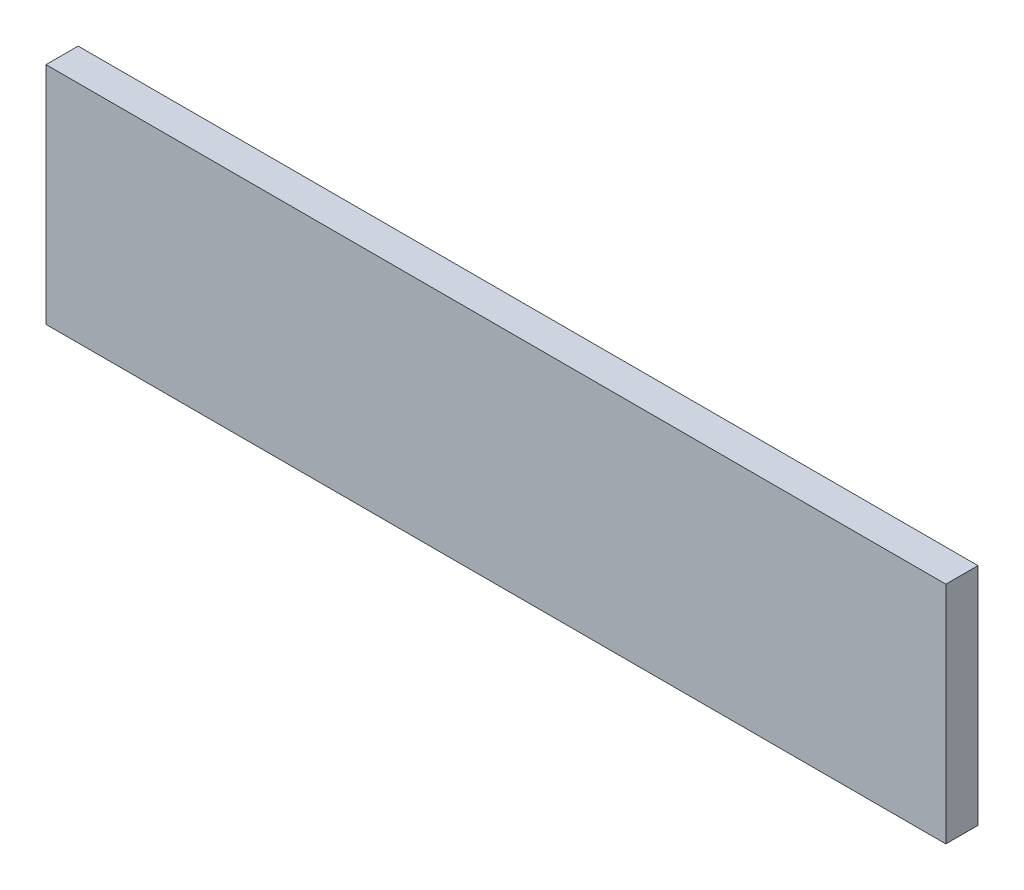
ISO-10303-21;
HEADER;
FILE_DESCRIPTION(('STEP AP214'),'2;1');
FILE_NAME('part.step','',(''),(''),'','','');
FILE_SCHEMA(('AUTOMOTIVE_DESIGN { 1 0 10303 214 1 1 1 1 }'));
ENDSEC;
DATA;
#1=APPLICATION_CONTEXT('core data for automotive mechanical design processes');
#2=APPLICATION_PROTOCOL_DEFINITION('international standard','automotive_design',2000,#1);
#3=PRODUCT_CONTEXT('',#1,'mechanical');
#4=PRODUCT('Part','Part','',(#3));
#5=PRODUCT_RELATED_PRODUCT_CATEGORY('part','',(#4));
#6=PRODUCT_DEFINITION_FORMATION('','',#4);
#7=PRODUCT_DEFINITION_CONTEXT('part definition',#1,'design');
#8=PRODUCT_DEFINITION('design','',#6,#7);
#9=PRODUCT_DEFINITION_SHAPE('','',#8);
#10=(LENGTH_UNIT() NAMED_UNIT(*) SI_UNIT(.MILLI.,.METRE.));
#11=(NAMED_UNIT(*) PLANE_ANGLE_UNIT() SI_UNIT($,.RADIAN.));
#12=(NAMED_UNIT(*) SI_UNIT($,.STERADIAN.) SOLID_ANGLE_UNIT());
#13=UNCERTAINTY_MEASURE_WITH_UNIT(LENGTH_MEASURE(1.E-05),#10,'distance_accuracy_value','');
#14=(GEOMETRIC_REPRESENTATION_CONTEXT(3) GLOBAL_UNCERTAINTY_ASSIGNED_CONTEXT((#13)) GLOBAL_UNIT_ASSIGNED_CONTEXT((#10,
#11,#12)) REPRESENTATION_CONTEXT('',''));
#15=CARTESIAN_POINT('',(0.,0.,0.));
#16=DIRECTION('',(0.,0.,1.));
#17=DIRECTION('',(1.,0.,0.));
#18=AXIS2_PLACEMENT_3D('',#15,#16,#17);
#19=CARTESIAN_POINT('',(-140.,-35.,10.));
#20=DIRECTION('',(1.,0.,0.));
#21=DIRECTION('',(0.,0.,-1.));
#22=AXIS2_PLACEMENT_3D('',#19,#20,#21);
#23=PLANE('',#22);
#24=DIRECTION('',(0.,-1.,0.));
#25=VECTOR('',#24,1.);
#26=CARTESIAN_POINT('',(-140.,-35.,0.));
#27=LINE('',#26,#25);
#28=CARTESIAN_POINT('',(-140.,35.,0.));
#29=VERTEX_POINT('',#28);
#30=CARTESIAN_POINT('',(-140.,-35.,0.));
#31=VERTEX_POINT('',#30);
#32=EDGE_CURVE('E95',#29,#31,#27,.T.);
#33=ORIENTED_EDGE('',*,*,#32,.T.);
#34=DIRECTION('',(0.,0.,-1.));
#35=VECTOR('',#34,1.);
#36=CARTESIAN_POINT('',(-140.,-35.,10.));
#37=LINE('',#36,#35);
#38=CARTESIAN_POINT('',(-140.,-35.,10.));
#39=VERTEX_POINT('',#38);
#40=EDGE_CURVE('E11',#39,#31,#37,.T.);
#41=ORIENTED_EDGE('',*,*,#40,.F.);
#42=DIRECTION('',(0.,-1.,0.));
#43=VECTOR('',#42,1.);
#44=CARTESIAN_POINT('',(-140.,-35.,10.));
#45=LINE('',#44,#43);
#46=CARTESIAN_POINT('',(-140.,35.,10.));
#47=VERTEX_POINT('',#46);
#48=EDGE_CURVE('E83',#47,#39,#45,.T.);
#49=ORIENTED_EDGE('',*,*,#48,.F.);
#50=DIRECTION('',(0.,0.,-1.));
#51=VECTOR('',#50,1.);
#52=CARTESIAN_POINT('',(-140.,35.,10.));
#53=LINE('',#52,#51);
#54=EDGE_CURVE('E91',#47,#29,#53,.T.);
#55=ORIENTED_EDGE('',*,*,#54,.T.);
#56=EDGE_LOOP('',(#33,#41,#49,#55));
#57=FACE_BOUND('',#56,.T.);
#58=ADVANCED_FACE('F32',(#57),#23,.F.);
#59=CARTESIAN_POINT('',(-140.,-35.,10.));
#60=DIRECTION('',(0.,1.,0.));
#61=DIRECTION('',(0.,0.,1.));
#62=AXIS2_PLACEMENT_3D('',#59,#60,#61);
#63=PLANE('',#62);
#64=DIRECTION('',(1.,0.,0.));
#65=VECTOR('',#64,1.);
#66=CARTESIAN_POINT('',(-140.,-35.,0.));
#67=LINE('',#66,#65);
#68=CARTESIAN_POINT('',(140.,-35.,0.));
#69=VERTEX_POINT('',#68);
#70=EDGE_CURVE('E87',#31,#69,#67,.T.);
#71=ORIENTED_EDGE('',*,*,#70,.T.);
#72=DIRECTION('',(0.,0.,-1.));
#73=VECTOR('',#72,1.);
#74=CARTESIAN_POINT('',(140.,-35.,10.));
#75=LINE('',#74,#73);
#76=CARTESIAN_POINT('',(140.,-35.,10.));
#77=VERTEX_POINT('',#76);
#78=EDGE_CURVE('E40',#77,#69,#75,.T.);
#79=ORIENTED_EDGE('',*,*,#78,.F.);
#80=DIRECTION('',(1.,0.,0.));
#81=VECTOR('',#80,1.);
#82=CARTESIAN_POINT('',(-140.,-35.,10.));
#83=LINE('',#82,#81);
#84=EDGE_CURVE('E78',#39,#77,#83,.T.);
#85=ORIENTED_EDGE('',*,*,#84,.F.);
#86=ORIENTED_EDGE('',*,*,#40,.T.);
#87=EDGE_LOOP('',(#71,#79,#85,#86));
#88=FACE_BOUND('',#87,.T.);
#89=ADVANCED_FACE('F86',(#88),#63,.F.);
#90=CARTESIAN_POINT('',(140.,-35.,10.));
#91=DIRECTION('',(-1.,0.,0.));
#92=DIRECTION('',(0.,0.,1.));
#93=AXIS2_PLACEMENT_3D('',#90,#91,#92);
#94=PLANE('',#93);
#95=DIRECTION('',(0.,1.,0.));
#96=VECTOR('',#95,1.);
#97=CARTESIAN_POINT('',(140.,-35.,0.));
#98=LINE('',#97,#96);
#99=CARTESIAN_POINT('',(140.,35.,0.));
#100=VERTEX_POINT('',#99);
#101=EDGE_CURVE('E65',#69,#100,#98,.T.);
#102=ORIENTED_EDGE('',*,*,#101,.T.);
#103=DIRECTION('',(0.,0.,-1.));
#104=VECTOR('',#103,1.);
#105=CARTESIAN_POINT('',(140.,35.,10.));
#106=LINE('',#105,#104);
#107=CARTESIAN_POINT('',(140.,35.,10.));
#108=VERTEX_POINT('',#107);
#109=EDGE_CURVE('E88',#108,#100,#106,.T.);
#110=ORIENTED_EDGE('',*,*,#109,.F.);
#111=DIRECTION('',(0.,1.,0.));
#112=VECTOR('',#111,1.);
#113=CARTESIAN_POINT('',(140.,-35.,10.));
#114=LINE('',#113,#112);
#115=EDGE_CURVE('E81',#77,#108,#114,.T.);
#116=ORIENTED_EDGE('',*,*,#115,.F.);
#117=ORIENTED_EDGE('',*,*,#78,.T.);
#118=EDGE_LOOP('',(#102,#110,#116,#117));
#119=FACE_BOUND('',#118,.T.);
#120=ADVANCED_FACE('F89',(#119),#94,.F.);
#121=CARTESIAN_POINT('',(-140.,35.,10.));
#122=DIRECTION('',(0.,-1.,0.));
#123=DIRECTION('',(0.,0.,-1.));
#124=AXIS2_PLACEMENT_3D('',#121,#122,#123);
#125=PLANE('',#124);
#126=DIRECTION('',(-1.,0.,0.));
#127=VECTOR('',#126,1.);
#128=CARTESIAN_POINT('',(-140.,35.,0.));
#129=LINE('',#128,#127);
#130=EDGE_CURVE('E71',#100,#29,#129,.T.);
#131=ORIENTED_EDGE('',*,*,#130,.T.);
#132=ORIENTED_EDGE('',*,*,#54,.F.);
#133=DIRECTION('',(-1.,0.,0.));
#134=VECTOR('',#133,1.);
#135=CARTESIAN_POINT('',(-140.,35.,10.));
#136=LINE('',#135,#134);
#137=EDGE_CURVE('E48',#108,#47,#136,.T.);
#138=ORIENTED_EDGE('',*,*,#137,.F.);
#139=ORIENTED_EDGE('',*,*,#109,.T.);
#140=EDGE_LOOP('',(#131,#132,#138,#139));
#141=FACE_BOUND('',#140,.T.);
#142=ADVANCED_FACE('F102',(#141),#125,.F.);
#143=CARTESIAN_POINT('',(0.,0.,10.));
#144=DIRECTION('',(0.,0.,-1.));
#145=DIRECTION('',(-1.,0.,0.));
#146=AXIS2_PLACEMENT_3D('',#143,#144,#145);
#147=PLANE('',#146);
#148=ORIENTED_EDGE('',*,*,#48,.T.);
#149=ORIENTED_EDGE('',*,*,#84,.T.);
#150=ORIENTED_EDGE('',*,*,#115,.T.);
#151=ORIENTED_EDGE('',*,*,#137,.T.);
#152=EDGE_LOOP('',(#148,#149,#150,#151));
#153=FACE_BOUND('',#152,.T.);
#154=ADVANCED_FACE('F79',(#153),#147,.F.);
#155=CARTESIAN_POINT('',(0.,0.,0.));
#156=DIRECTION('',(0.,0.,-1.));
#157=DIRECTION('',(-1.,0.,0.));
#158=AXIS2_PLACEMENT_3D('',#155,#156,#157);
#159=PLANE('',#158);
#160=ORIENTED_EDGE('',*,*,#32,.F.);
#161=ORIENTED_EDGE('',*,*,#130,.F.);
#162=ORIENTED_EDGE('',*,*,#101,.F.);
#163=ORIENTED_EDGE('',*,*,#70,.F.);
#164=EDGE_LOOP('',(#160,#161,#162,#163));
#165=FACE_BOUND('',#164,.T.);
#166=ADVANCED_FACE('F105',(#165),#159,.T.);
#167=CLOSED_SHELL('',(#58,#89,#120,#142,#154,#166));
#168=MANIFOLD_SOLID_BREP('B2',#167);
#169=ADVANCED_BREP_SHAPE_REPRESENTATION('',(#18,#168),#14);
#170=SHAPE_DEFINITION_REPRESENTATION(#9,#169);
ENDSEC;
END-ISO-10303-21;
